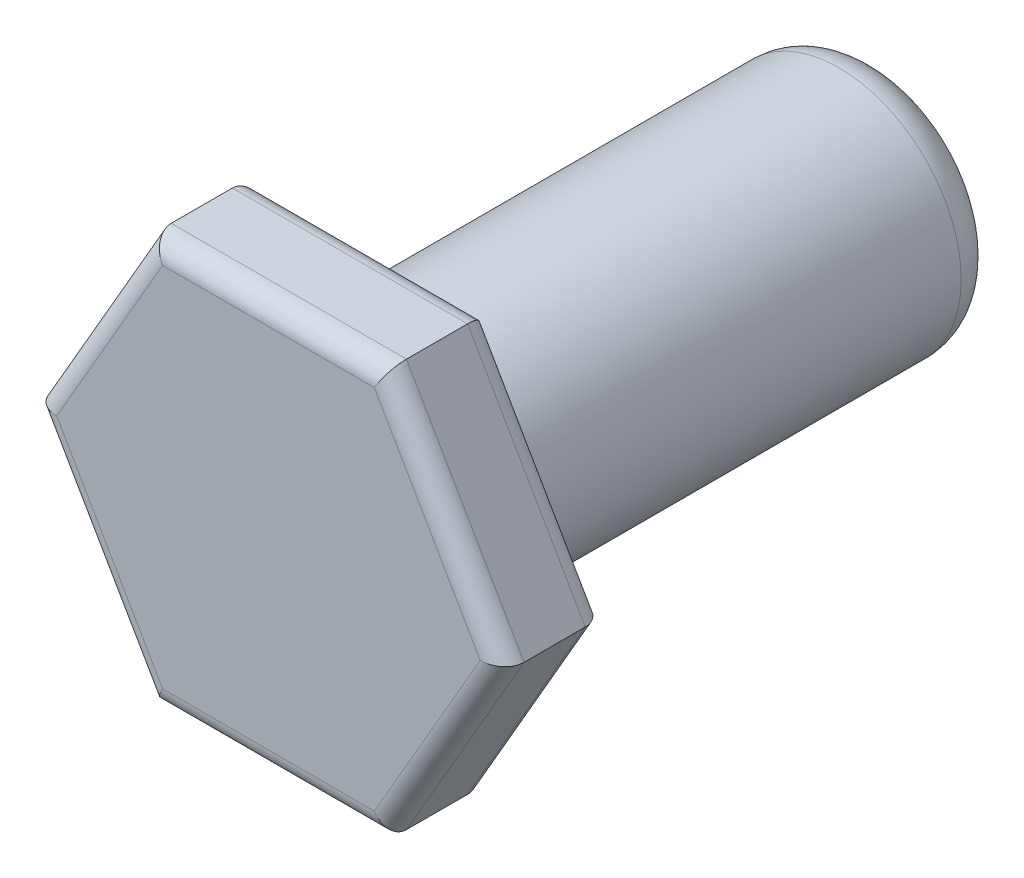
ISO-10303-21;
HEADER;
FILE_DESCRIPTION(('STEP AP214'),'2;1');
FILE_NAME('part.step','',(''),(''),'','','');
FILE_SCHEMA(('AUTOMOTIVE_DESIGN { 1 0 10303 214 1 1 1 1 }'));
ENDSEC;
DATA;
#1=APPLICATION_CONTEXT('core data for automotive mechanical design processes');
#2=APPLICATION_PROTOCOL_DEFINITION('international standard','automotive_design',2000,#1);
#3=PRODUCT_CONTEXT('',#1,'mechanical');
#4=PRODUCT('Part','Part','',(#3));
#5=PRODUCT_RELATED_PRODUCT_CATEGORY('part','',(#4));
#6=PRODUCT_DEFINITION_FORMATION('','',#4);
#7=PRODUCT_DEFINITION_CONTEXT('part definition',#1,'design');
#8=PRODUCT_DEFINITION('design','',#6,#7);
#9=PRODUCT_DEFINITION_SHAPE('','',#8);
#10=(LENGTH_UNIT() NAMED_UNIT(*) SI_UNIT(.MILLI.,.METRE.));
#11=(NAMED_UNIT(*) PLANE_ANGLE_UNIT() SI_UNIT($,.RADIAN.));
#12=(NAMED_UNIT(*) SI_UNIT($,.STERADIAN.) SOLID_ANGLE_UNIT());
#13=UNCERTAINTY_MEASURE_WITH_UNIT(LENGTH_MEASURE(1.E-05),#10,'distance_accuracy_value','');
#14=(GEOMETRIC_REPRESENTATION_CONTEXT(3) GLOBAL_UNCERTAINTY_ASSIGNED_CONTEXT((#13)) GLOBAL_UNIT_ASSIGNED_CONTEXT((#10,
#11,#12)) REPRESENTATION_CONTEXT('',''));
#15=CARTESIAN_POINT('',(0.,0.,0.));
#16=DIRECTION('',(0.,0.,1.));
#17=DIRECTION('',(1.,0.,0.));
#18=AXIS2_PLACEMENT_3D('',#15,#16,#17);
#19=CARTESIAN_POINT('',(0.,0.,25.));
#20=DIRECTION('',(0.,0.,-1.));
#21=DIRECTION('',(-1.,0.,0.));
#22=AXIS2_PLACEMENT_3D('',#19,#20,#21);
#23=CYLINDRICAL_SURFACE('',#22,6.);
#24=CARTESIAN_POINT('',(0.,0.,2.));
#25=DIRECTION('',(0.,0.,1.));
#26=DIRECTION('',(1.,0.,0.));
#27=AXIS2_PLACEMENT_3D('',#24,#25,#26);
#28=CIRCLE('',#27,6.);
#29=CARTESIAN_POINT('',(6.,0.,2.));
#30=VERTEX_POINT('',#29);
#31=EDGE_CURVE('E153',#30,#30,#28,.T.);
#32=ORIENTED_EDGE('',*,*,#31,.T.);
#33=EDGE_LOOP('',(#32));
#34=FACE_BOUND('',#33,.T.);
#35=CARTESIAN_POINT('',(0.,0.,25.));
#36=DIRECTION('',(0.,0.,1.));
#37=DIRECTION('',(1.,0.,0.));
#38=AXIS2_PLACEMENT_3D('',#35,#36,#37);
#39=CIRCLE('',#38,6.);
#40=CARTESIAN_POINT('',(6.,0.,25.));
#41=VERTEX_POINT('',#40);
#42=EDGE_CURVE('E258',#41,#41,#39,.T.);
#43=ORIENTED_EDGE('',*,*,#42,.F.);
#44=EDGE_LOOP('',(#43));
#45=FACE_BOUND('',#44,.T.);
#46=ADVANCED_FACE('F34',(#34,#45),#23,.T.);
#47=CARTESIAN_POINT('',(0.,0.,0.));
#48=DIRECTION('',(0.,0.,1.));
#49=DIRECTION('',(1.,0.,0.));
#50=AXIS2_PLACEMENT_3D('',#47,#48,#49);
#51=PLANE('',#50);
#52=CARTESIAN_POINT('',(0.,0.,0.));
#53=DIRECTION('',(0.,0.,1.));
#54=DIRECTION('',(1.,0.,0.));
#55=AXIS2_PLACEMENT_3D('',#52,#53,#54);
#56=CIRCLE('',#55,4.);
#57=CARTESIAN_POINT('',(4.,0.,0.));
#58=VERTEX_POINT('',#57);
#59=EDGE_CURVE('E150',#58,#58,#56,.F.);
#60=ORIENTED_EDGE('',*,*,#59,.T.);
#61=EDGE_LOOP('',(#60));
#62=FACE_BOUND('',#61,.T.);
#63=ADVANCED_FACE('F285',(#62),#51,.F.);
#64=CARTESIAN_POINT('',(0.,0.,25.));
#65=DIRECTION('',(0.,0.,1.));
#66=DIRECTION('',(1.,0.,0.));
#67=AXIS2_PLACEMENT_3D('',#64,#65,#66);
#68=PLANE('',#67);
#69=DIRECTION('',(-1.,0.,0.));
#70=VECTOR('',#69,1.);
#71=CARTESIAN_POINT('',(0.,9.,25.));
#72=LINE('',#71,#70);
#73=CARTESIAN_POINT('',(-5.19615242270663,9.,25.));
#74=VERTEX_POINT('',#73);
#75=CARTESIAN_POINT('',(5.19615242270663,9.,25.));
#76=VERTEX_POINT('',#75);
#77=EDGE_CURVE('E182',#74,#76,#72,.F.);
#78=ORIENTED_EDGE('',*,*,#77,.T.);
#79=DIRECTION('',(-0.5,0.866025403784438,0.));
#80=VECTOR('',#79,1.);
#81=CARTESIAN_POINT('',(7.79422863405995,4.5,25.));
#82=LINE('',#81,#80);
#83=CARTESIAN_POINT('',(10.3923048454133,0.,25.));
#84=VERTEX_POINT('',#83);
#85=EDGE_CURVE('E188',#76,#84,#82,.F.);
#86=ORIENTED_EDGE('',*,*,#85,.T.);
#87=DIRECTION('',(0.5,0.866025403784439,0.));
#88=VECTOR('',#87,1.);
#89=CARTESIAN_POINT('',(7.79422863405995,-4.5,25.));
#90=LINE('',#89,#88);
#91=CARTESIAN_POINT('',(5.19615242270663,-9.,25.));
#92=VERTEX_POINT('',#91);
#93=EDGE_CURVE('E186',#84,#92,#90,.F.);
#94=ORIENTED_EDGE('',*,*,#93,.T.);
#95=DIRECTION('',(1.,0.,0.));
#96=VECTOR('',#95,1.);
#97=CARTESIAN_POINT('',(0.,-9.,25.));
#98=LINE('',#97,#96);
#99=CARTESIAN_POINT('',(-5.19615242270663,-9.,25.));
#100=VERTEX_POINT('',#99);
#101=EDGE_CURVE('E184',#92,#100,#98,.F.);
#102=ORIENTED_EDGE('',*,*,#101,.T.);
#103=DIRECTION('',(0.5,-0.866025403784439,0.));
#104=VECTOR('',#103,1.);
#105=CARTESIAN_POINT('',(-7.79422863405994,-4.5,25.));
#106=LINE('',#105,#104);
#107=CARTESIAN_POINT('',(-10.3923048454133,0.,25.));
#108=VERTEX_POINT('',#107);
#109=EDGE_CURVE('E178',#100,#108,#106,.F.);
#110=ORIENTED_EDGE('',*,*,#109,.T.);
#111=DIRECTION('',(-0.5,-0.866025403784439,0.));
#112=VECTOR('',#111,1.);
#113=CARTESIAN_POINT('',(-7.79422863405995,4.5,25.));
#114=LINE('',#113,#112);
#115=EDGE_CURVE('E180',#108,#74,#114,.F.);
#116=ORIENTED_EDGE('',*,*,#115,.T.);
#117=EDGE_LOOP('',(#78,#86,#94,#102,#110,#116));
#118=FACE_BOUND('',#117,.T.);
#119=ORIENTED_EDGE('',*,*,#42,.T.);
#120=EDGE_LOOP('',(#119));
#121=FACE_BOUND('',#120,.T.);
#122=ADVANCED_FACE('F232',(#118,#121),#68,.F.);
#123=CARTESIAN_POINT('',(-5.77350269189626,-10.,30.));
#124=DIRECTION('',(0.,1.,0.));
#125=DIRECTION('',(0.,0.,1.));
#126=AXIS2_PLACEMENT_3D('',#123,#124,#125);
#127=PLANE('',#126);
#128=DIRECTION('',(0.,0.,-1.));
#129=VECTOR('',#128,1.);
#130=CARTESIAN_POINT('',(5.77350269189626,-10.,30.));
#131=LINE('',#130,#129);
#132=CARTESIAN_POINT('',(5.77350269189626,-10.,29.));
#133=VERTEX_POINT('',#132);
#134=CARTESIAN_POINT('',(5.77350269189626,-10.,26.));
#135=VERTEX_POINT('',#134);
#136=EDGE_CURVE('E250',#133,#135,#131,.T.);
#137=ORIENTED_EDGE('',*,*,#136,.F.);
#138=DIRECTION('',(1.,0.,0.));
#139=VECTOR('',#138,1.);
#140=CARTESIAN_POINT('',(-5.77350269189626,-10.,29.));
#141=LINE('',#140,#139);
#142=CARTESIAN_POINT('',(-5.77350269189626,-10.,29.));
#143=VERTEX_POINT('',#142);
#144=EDGE_CURVE('E193',#133,#143,#141,.F.);
#145=ORIENTED_EDGE('',*,*,#144,.T.);
#146=DIRECTION('',(0.,0.,-1.));
#147=VECTOR('',#146,1.);
#148=CARTESIAN_POINT('',(-5.77350269189626,-10.,30.));
#149=LINE('',#148,#147);
#150=CARTESIAN_POINT('',(-5.77350269189626,-10.,26.));
#151=VERTEX_POINT('',#150);
#152=EDGE_CURVE('E143',#143,#151,#149,.T.);
#153=ORIENTED_EDGE('',*,*,#152,.T.);
#154=DIRECTION('',(1.,0.,0.));
#155=VECTOR('',#154,1.);
#156=CARTESIAN_POINT('',(-5.77350269189626,-10.,26.));
#157=LINE('',#156,#155);
#158=EDGE_CURVE('E191',#151,#135,#157,.T.);
#159=ORIENTED_EDGE('',*,*,#158,.T.);
#160=EDGE_LOOP('',(#137,#145,#153,#159));
#161=FACE_BOUND('',#160,.T.);
#162=ADVANCED_FACE('F292',(#161),#127,.F.);
#163=CARTESIAN_POINT('',(5.77350269189626,-10.,30.));
#164=DIRECTION('',(-0.866025403784439,0.5,0.));
#165=DIRECTION('',(-0.5,-0.866025403784439,0.));
#166=AXIS2_PLACEMENT_3D('',#163,#164,#165);
#167=PLANE('',#166);
#168=DIRECTION('',(0.,0.,-1.));
#169=VECTOR('',#168,1.);
#170=CARTESIAN_POINT('',(11.5470053837925,0.,30.));
#171=LINE('',#170,#169);
#172=CARTESIAN_POINT('',(11.5470053837925,0.,29.));
#173=VERTEX_POINT('',#172);
#174=CARTESIAN_POINT('',(11.5470053837925,0.,26.));
#175=VERTEX_POINT('',#174);
#176=EDGE_CURVE('E247',#173,#175,#171,.T.);
#177=ORIENTED_EDGE('',*,*,#176,.F.);
#178=DIRECTION('',(0.5,0.866025403784439,0.));
#179=VECTOR('',#178,1.);
#180=CARTESIAN_POINT('',(5.77350269189626,-10.,29.));
#181=LINE('',#180,#179);
#182=EDGE_CURVE('E166',#173,#133,#181,.F.);
#183=ORIENTED_EDGE('',*,*,#182,.T.);
#184=ORIENTED_EDGE('',*,*,#136,.T.);
#185=DIRECTION('',(0.5,0.866025403784439,0.));
#186=VECTOR('',#185,1.);
#187=CARTESIAN_POINT('',(5.77350269189626,-10.,26.));
#188=LINE('',#187,#186);
#189=EDGE_CURVE('E164',#135,#175,#188,.T.);
#190=ORIENTED_EDGE('',*,*,#189,.T.);
#191=EDGE_LOOP('',(#177,#183,#184,#190));
#192=FACE_BOUND('',#191,.T.);
#193=ADVANCED_FACE('F246',(#192),#167,.F.);
#194=CARTESIAN_POINT('',(11.5470053837925,0.,30.));
#195=DIRECTION('',(-0.866025403784438,-0.5,0.));
#196=DIRECTION('',(0.5,-0.866025403784438,0.));
#197=AXIS2_PLACEMENT_3D('',#194,#195,#196);
#198=PLANE('',#197);
#199=DIRECTION('',(0.,0.,-1.));
#200=VECTOR('',#199,1.);
#201=CARTESIAN_POINT('',(5.77350269189625,10.,30.));
#202=LINE('',#201,#200);
#203=CARTESIAN_POINT('',(5.77350269189625,10.,29.));
#204=VERTEX_POINT('',#203);
#205=CARTESIAN_POINT('',(5.77350269189625,10.,26.));
#206=VERTEX_POINT('',#205);
#207=EDGE_CURVE('E256',#204,#206,#202,.T.);
#208=ORIENTED_EDGE('',*,*,#207,.F.);
#209=DIRECTION('',(-0.5,0.866025403784438,0.));
#210=VECTOR('',#209,1.);
#211=CARTESIAN_POINT('',(11.5470053837925,0.,29.));
#212=LINE('',#211,#210);
#213=EDGE_CURVE('E172',#204,#173,#212,.F.);
#214=ORIENTED_EDGE('',*,*,#213,.T.);
#215=ORIENTED_EDGE('',*,*,#176,.T.);
#216=DIRECTION('',(-0.5,0.866025403784438,0.));
#217=VECTOR('',#216,1.);
#218=CARTESIAN_POINT('',(11.5470053837925,0.,26.));
#219=LINE('',#218,#217);
#220=EDGE_CURVE('E169',#175,#206,#219,.T.);
#221=ORIENTED_EDGE('',*,*,#220,.T.);
#222=EDGE_LOOP('',(#208,#214,#215,#221));
#223=FACE_BOUND('',#222,.T.);
#224=ADVANCED_FACE('F253',(#223),#198,.F.);
#225=CARTESIAN_POINT('',(5.77350269189625,10.,30.));
#226=DIRECTION('',(0.,-1.,0.));
#227=DIRECTION('',(1.,0.,0.));
#228=AXIS2_PLACEMENT_3D('',#225,#226,#227);
#229=PLANE('',#228);
#230=DIRECTION('',(0.,0.,-1.));
#231=VECTOR('',#230,1.);
#232=CARTESIAN_POINT('',(-5.77350269189626,10.,30.));
#233=LINE('',#232,#231);
#234=CARTESIAN_POINT('',(-5.77350269189626,10.,29.));
#235=VERTEX_POINT('',#234);
#236=CARTESIAN_POINT('',(-5.77350269189626,10.,26.));
#237=VERTEX_POINT('',#236);
#238=EDGE_CURVE('E260',#235,#237,#233,.T.);
#239=ORIENTED_EDGE('',*,*,#238,.F.);
#240=DIRECTION('',(-1.,0.,0.));
#241=VECTOR('',#240,1.);
#242=CARTESIAN_POINT('',(5.77350269189625,10.,29.));
#243=LINE('',#242,#241);
#244=EDGE_CURVE('E176',#235,#204,#243,.F.);
#245=ORIENTED_EDGE('',*,*,#244,.T.);
#246=ORIENTED_EDGE('',*,*,#207,.T.);
#247=DIRECTION('',(-1.,0.,0.));
#248=VECTOR('',#247,1.);
#249=CARTESIAN_POINT('',(5.77350269189625,10.,26.));
#250=LINE('',#249,#248);
#251=EDGE_CURVE('E174',#206,#237,#250,.T.);
#252=ORIENTED_EDGE('',*,*,#251,.T.);
#253=EDGE_LOOP('',(#239,#245,#246,#252));
#254=FACE_BOUND('',#253,.T.);
#255=ADVANCED_FACE('F300',(#254),#229,.F.);
#256=CARTESIAN_POINT('',(-5.77350269189626,10.,30.));
#257=DIRECTION('',(0.866025403784439,-0.5,0.));
#258=DIRECTION('',(0.5,0.866025403784439,0.));
#259=AXIS2_PLACEMENT_3D('',#256,#257,#258);
#260=PLANE('',#259);
#261=ORIENTED_EDGE('',*,*,#238,.T.);
#262=DIRECTION('',(-0.5,-0.866025403784439,0.));
#263=VECTOR('',#262,1.);
#264=CARTESIAN_POINT('',(-5.77350269189626,10.,26.));
#265=LINE('',#264,#263);
#266=CARTESIAN_POINT('',(-11.5470053837925,0.,26.));
#267=VERTEX_POINT('',#266);
#268=EDGE_CURVE('E51',#237,#267,#265,.T.);
#269=ORIENTED_EDGE('',*,*,#268,.T.);
#270=DIRECTION('',(0.,0.,-1.));
#271=VECTOR('',#270,1.);
#272=CARTESIAN_POINT('',(-11.5470053837925,0.,30.));
#273=LINE('',#272,#271);
#274=CARTESIAN_POINT('',(-11.5470053837925,0.,29.));
#275=VERTEX_POINT('',#274);
#276=EDGE_CURVE('E455',#275,#267,#273,.T.);
#277=ORIENTED_EDGE('',*,*,#276,.F.);
#278=DIRECTION('',(-0.5,-0.866025403784439,0.));
#279=VECTOR('',#278,1.);
#280=CARTESIAN_POINT('',(-5.77350269189626,10.,29.));
#281=LINE('',#280,#279);
#282=EDGE_CURVE('E141',#275,#235,#281,.F.);
#283=ORIENTED_EDGE('',*,*,#282,.T.);
#284=EDGE_LOOP('',(#261,#269,#277,#283));
#285=FACE_BOUND('',#284,.T.);
#286=ADVANCED_FACE('F303',(#285),#260,.F.);
#287=CARTESIAN_POINT('',(-11.5470053837925,0.,30.));
#288=DIRECTION('',(0.866025403784438,0.5,0.));
#289=DIRECTION('',(-0.5,0.866025403784439,0.));
#290=AXIS2_PLACEMENT_3D('',#287,#288,#289);
#291=PLANE('',#290);
#292=ORIENTED_EDGE('',*,*,#152,.F.);
#293=DIRECTION('',(0.5,-0.866025403784439,0.));
#294=VECTOR('',#293,1.);
#295=CARTESIAN_POINT('',(-11.5470053837925,0.,29.));
#296=LINE('',#295,#294);
#297=EDGE_CURVE('E11',#143,#275,#296,.F.);
#298=ORIENTED_EDGE('',*,*,#297,.T.);
#299=ORIENTED_EDGE('',*,*,#276,.T.);
#300=DIRECTION('',(0.5,-0.866025403784439,0.));
#301=VECTOR('',#300,1.);
#302=CARTESIAN_POINT('',(-11.5470053837925,0.,26.));
#303=LINE('',#302,#301);
#304=EDGE_CURVE('E43',#267,#151,#303,.T.);
#305=ORIENTED_EDGE('',*,*,#304,.T.);
#306=EDGE_LOOP('',(#292,#298,#299,#305));
#307=FACE_BOUND('',#306,.T.);
#308=ADVANCED_FACE('F279',(#307),#291,.F.);
#309=CARTESIAN_POINT('',(0.,0.,30.));
#310=DIRECTION('',(0.,0.,1.));
#311=DIRECTION('',(1.,0.,0.));
#312=AXIS2_PLACEMENT_3D('',#309,#310,#311);
#313=PLANE('',#312);
#314=DIRECTION('',(1.,0.,0.));
#315=VECTOR('',#314,1.);
#316=CARTESIAN_POINT('',(5.77350269189626,-9.,30.));
#317=LINE('',#316,#315);
#318=CARTESIAN_POINT('',(-5.19615242270663,-9.,30.));
#319=VERTEX_POINT('',#318);
#320=CARTESIAN_POINT('',(5.19615242270663,-9.,30.));
#321=VERTEX_POINT('',#320);
#322=EDGE_CURVE('E135',#319,#321,#317,.T.);
#323=ORIENTED_EDGE('',*,*,#322,.T.);
#324=DIRECTION('',(0.5,0.866025403784439,0.));
#325=VECTOR('',#324,1.);
#326=CARTESIAN_POINT('',(10.6809799800081,0.500000000000005,30.));
#327=LINE('',#326,#325);
#328=CARTESIAN_POINT('',(10.3923048454133,0.,30.));
#329=VERTEX_POINT('',#328);
#330=EDGE_CURVE('E161',#321,#329,#327,.T.);
#331=ORIENTED_EDGE('',*,*,#330,.T.);
#332=DIRECTION('',(-0.5,0.866025403784438,0.));
#333=VECTOR('',#332,1.);
#334=CARTESIAN_POINT('',(4.90747728811182,9.5,30.));
#335=LINE('',#334,#333);
#336=CARTESIAN_POINT('',(5.19615242270663,9.,30.));
#337=VERTEX_POINT('',#336);
#338=EDGE_CURVE('E159',#329,#337,#335,.T.);
#339=ORIENTED_EDGE('',*,*,#338,.T.);
#340=DIRECTION('',(-1.,0.,0.));
#341=VECTOR('',#340,1.);
#342=CARTESIAN_POINT('',(-5.77350269189626,9.,30.));
#343=LINE('',#342,#341);
#344=CARTESIAN_POINT('',(-5.19615242270663,9.,30.));
#345=VERTEX_POINT('',#344);
#346=EDGE_CURVE('E131',#337,#345,#343,.T.);
#347=ORIENTED_EDGE('',*,*,#346,.T.);
#348=DIRECTION('',(-0.5,-0.866025403784439,0.));
#349=VECTOR('',#348,1.);
#350=CARTESIAN_POINT('',(-10.6809799800081,-0.499999999999999,30.));
#351=LINE('',#350,#349);
#352=CARTESIAN_POINT('',(-10.3923048454133,0.,30.));
#353=VERTEX_POINT('',#352);
#354=EDGE_CURVE('E124',#345,#353,#351,.T.);
#355=ORIENTED_EDGE('',*,*,#354,.T.);
#356=DIRECTION('',(0.5,-0.866025403784439,0.));
#357=VECTOR('',#356,1.);
#358=CARTESIAN_POINT('',(-4.90747728811181,-9.5,30.));
#359=LINE('',#358,#357);
#360=EDGE_CURVE('E128',#353,#319,#359,.T.);
#361=ORIENTED_EDGE('',*,*,#360,.T.);
#362=EDGE_LOOP('',(#323,#331,#339,#347,#355,#361));
#363=FACE_BOUND('',#362,.T.);
#364=ADVANCED_FACE('F126',(#363),#313,.T.);
#365=CARTESIAN_POINT('',(0.,0.,2.));
#366=DIRECTION('',(0.,0.,1.));
#367=DIRECTION('',(1.,0.,0.));
#368=AXIS2_PLACEMENT_3D('',#365,#366,#367);
#369=TOROIDAL_SURFACE('',#368,4.,2.);
#370=ORIENTED_EDGE('',*,*,#59,.F.);
#371=EDGE_LOOP('',(#370));
#372=FACE_BOUND('',#371,.T.);
#373=ORIENTED_EDGE('',*,*,#31,.F.);
#374=EDGE_LOOP('',(#373));
#375=FACE_BOUND('',#374,.T.);
#376=ADVANCED_FACE('F270',(#372,#375),#369,.T.);
#377=CARTESIAN_POINT('',(-7.79422863405995,4.5,29.));
#378=DIRECTION('',(0.5,0.866025403784439,0.));
#379=DIRECTION('',(-0.866025403784439,0.5,0.));
#380=AXIS2_PLACEMENT_3D('',#377,#378,#379);
#381=CYLINDRICAL_SURFACE('',#380,1.);
#382=CARTESIAN_POINT('',(-5.19615242270663,9.,29.));
#383=DIRECTION('',(0.866025403784439,0.5,0.));
#384=DIRECTION('',(-0.5,0.866025403784439,0.));
#385=AXIS2_PLACEMENT_3D('',#382,#383,#384);
#386=ELLIPSE('',#385,1.15470053837925,1.);
#387=EDGE_CURVE('E144',#235,#345,#386,.T.);
#388=ORIENTED_EDGE('',*,*,#387,.F.);
#389=ORIENTED_EDGE('',*,*,#282,.F.);
#390=CARTESIAN_POINT('',(-10.3923048454133,0.,29.));
#391=DIRECTION('',(0.,1.,0.));
#392=DIRECTION('',(-1.,0.,0.));
#393=AXIS2_PLACEMENT_3D('',#390,#391,#392);
#394=ELLIPSE('',#393,1.15470053837925,1.);
#395=EDGE_CURVE('E139',#353,#275,#394,.F.);
#396=ORIENTED_EDGE('',*,*,#395,.F.);
#397=ORIENTED_EDGE('',*,*,#354,.F.);
#398=EDGE_LOOP('',(#388,#389,#396,#397));
#399=FACE_BOUND('',#398,.T.);
#400=ADVANCED_FACE('F140',(#399),#381,.T.);
#401=CARTESIAN_POINT('',(-7.79422863405994,-4.5,29.));
#402=DIRECTION('',(-0.5,0.866025403784439,0.));
#403=DIRECTION('',(-0.866025403784438,-0.5,0.));
#404=AXIS2_PLACEMENT_3D('',#401,#402,#403);
#405=CYLINDRICAL_SURFACE('',#404,1.);
#406=ORIENTED_EDGE('',*,*,#395,.T.);
#407=ORIENTED_EDGE('',*,*,#297,.F.);
#408=CARTESIAN_POINT('',(-5.19615242270663,-9.,29.));
#409=DIRECTION('',(-0.866025403784439,0.5,0.));
#410=DIRECTION('',(0.5,0.866025403784439,0.));
#411=AXIS2_PLACEMENT_3D('',#408,#409,#410);
#412=ELLIPSE('',#411,1.15470053837925,1.);
#413=EDGE_CURVE('E148',#319,#143,#412,.F.);
#414=ORIENTED_EDGE('',*,*,#413,.F.);
#415=ORIENTED_EDGE('',*,*,#360,.F.);
#416=EDGE_LOOP('',(#406,#407,#414,#415));
#417=FACE_BOUND('',#416,.T.);
#418=ADVANCED_FACE('F146',(#417),#405,.T.);
#419=CARTESIAN_POINT('',(0.,9.,29.));
#420=DIRECTION('',(1.,0.,0.));
#421=DIRECTION('',(0.,1.,0.));
#422=AXIS2_PLACEMENT_3D('',#419,#420,#421);
#423=CYLINDRICAL_SURFACE('',#422,1.);
#424=ORIENTED_EDGE('',*,*,#387,.T.);
#425=ORIENTED_EDGE('',*,*,#346,.F.);
#426=CARTESIAN_POINT('',(5.19615242270663,9.,29.));
#427=DIRECTION('',(0.866025403784439,-0.5,0.));
#428=DIRECTION('',(0.5,0.866025403784439,0.));
#429=AXIS2_PLACEMENT_3D('',#426,#427,#428);
#430=ELLIPSE('',#429,1.15470053837925,1.);
#431=EDGE_CURVE('E202',#204,#337,#430,.T.);
#432=ORIENTED_EDGE('',*,*,#431,.F.);
#433=ORIENTED_EDGE('',*,*,#244,.F.);
#434=EDGE_LOOP('',(#424,#425,#432,#433));
#435=FACE_BOUND('',#434,.T.);
#436=ADVANCED_FACE('F358',(#435),#423,.T.);
#437=CARTESIAN_POINT('',(0.,-9.,29.));
#438=DIRECTION('',(-1.,0.,0.));
#439=DIRECTION('',(0.,0.,1.));
#440=AXIS2_PLACEMENT_3D('',#437,#438,#439);
#441=CYLINDRICAL_SURFACE('',#440,1.);
#442=ORIENTED_EDGE('',*,*,#413,.T.);
#443=ORIENTED_EDGE('',*,*,#144,.F.);
#444=CARTESIAN_POINT('',(5.19615242270663,-9.,29.));
#445=DIRECTION('',(-0.866025403784439,-0.5,0.));
#446=DIRECTION('',(-0.5,0.866025403784439,0.));
#447=AXIS2_PLACEMENT_3D('',#444,#445,#446);
#448=ELLIPSE('',#447,1.15470053837925,1.);
#449=EDGE_CURVE('E200',#321,#133,#448,.F.);
#450=ORIENTED_EDGE('',*,*,#449,.F.);
#451=ORIENTED_EDGE('',*,*,#322,.F.);
#452=EDGE_LOOP('',(#442,#443,#450,#451));
#453=FACE_BOUND('',#452,.T.);
#454=ADVANCED_FACE('F367',(#453),#441,.T.);
#455=CARTESIAN_POINT('',(7.79422863405995,4.5,29.));
#456=DIRECTION('',(0.5,-0.866025403784438,0.));
#457=DIRECTION('',(0.866025403784438,0.5,0.));
#458=AXIS2_PLACEMENT_3D('',#455,#456,#457);
#459=CYLINDRICAL_SURFACE('',#458,1.);
#460=ORIENTED_EDGE('',*,*,#431,.T.);
#461=ORIENTED_EDGE('',*,*,#338,.F.);
#462=CARTESIAN_POINT('',(10.3923048454133,0.,29.));
#463=DIRECTION('',(0.,-1.,0.));
#464=DIRECTION('',(1.,0.,0.));
#465=AXIS2_PLACEMENT_3D('',#462,#463,#464);
#466=ELLIPSE('',#465,1.15470053837925,1.);
#467=EDGE_CURVE('E198',#173,#329,#466,.T.);
#468=ORIENTED_EDGE('',*,*,#467,.F.);
#469=ORIENTED_EDGE('',*,*,#213,.F.);
#470=EDGE_LOOP('',(#460,#461,#468,#469));
#471=FACE_BOUND('',#470,.T.);
#472=ADVANCED_FACE('F377',(#471),#459,.T.);
#473=CARTESIAN_POINT('',(7.79422863405995,-4.5,29.));
#474=DIRECTION('',(-0.5,-0.866025403784439,0.));
#475=DIRECTION('',(0.866025403784439,-0.5,0.));
#476=AXIS2_PLACEMENT_3D('',#473,#474,#475);
#477=CYLINDRICAL_SURFACE('',#476,1.);
#478=ORIENTED_EDGE('',*,*,#449,.T.);
#479=ORIENTED_EDGE('',*,*,#182,.F.);
#480=ORIENTED_EDGE('',*,*,#467,.T.);
#481=ORIENTED_EDGE('',*,*,#330,.F.);
#482=EDGE_LOOP('',(#478,#479,#480,#481));
#483=FACE_BOUND('',#482,.T.);
#484=ADVANCED_FACE('F387',(#483),#477,.T.);
#485=CARTESIAN_POINT('',(-10.6809799800081,0.500000000000002,26.));
#486=DIRECTION('',(0.5,-0.866025403784439,0.));
#487=DIRECTION('',(0.866025403784438,0.5,0.));
#488=AXIS2_PLACEMENT_3D('',#485,#486,#487);
#489=CYLINDRICAL_SURFACE('',#488,1.);
#490=CARTESIAN_POINT('',(-10.3923048454133,0.,26.));
#491=DIRECTION('',(0.,-1.,0.));
#492=DIRECTION('',(1.,0.,0.));
#493=AXIS2_PLACEMENT_3D('',#490,#491,#492);
#494=ELLIPSE('',#493,1.15470053837925,1.);
#495=EDGE_CURVE('E216',#108,#267,#494,.F.);
#496=ORIENTED_EDGE('',*,*,#495,.F.);
#497=ORIENTED_EDGE('',*,*,#109,.F.);
#498=CARTESIAN_POINT('',(-5.19615242270663,-9.,26.));
#499=DIRECTION('',(0.866025403784439,-0.5,0.));
#500=DIRECTION('',(-0.5,-0.866025403784439,0.));
#501=AXIS2_PLACEMENT_3D('',#498,#499,#500);
#502=ELLIPSE('',#501,1.15470053837925,1.);
#503=EDGE_CURVE('E38',#151,#100,#502,.T.);
#504=ORIENTED_EDGE('',*,*,#503,.F.);
#505=ORIENTED_EDGE('',*,*,#304,.F.);
#506=EDGE_LOOP('',(#496,#497,#504,#505));
#507=FACE_BOUND('',#506,.T.);
#508=ADVANCED_FACE('F36',(#507),#489,.T.);
#509=CARTESIAN_POINT('',(-5.77350269189626,-9.,26.));
#510=DIRECTION('',(1.,0.,0.));
#511=DIRECTION('',(0.,0.,-1.));
#512=AXIS2_PLACEMENT_3D('',#509,#510,#511);
#513=CYLINDRICAL_SURFACE('',#512,1.);
#514=ORIENTED_EDGE('',*,*,#503,.T.);
#515=ORIENTED_EDGE('',*,*,#101,.F.);
#516=CARTESIAN_POINT('',(5.19615242270663,-9.,26.));
#517=DIRECTION('',(0.866025403784439,0.5,0.));
#518=DIRECTION('',(0.5,-0.866025403784439,0.));
#519=AXIS2_PLACEMENT_3D('',#516,#517,#518);
#520=ELLIPSE('',#519,1.15470053837925,1.);
#521=EDGE_CURVE('E214',#135,#92,#520,.T.);
#522=ORIENTED_EDGE('',*,*,#521,.F.);
#523=ORIENTED_EDGE('',*,*,#158,.F.);
#524=EDGE_LOOP('',(#514,#515,#522,#523));
#525=FACE_BOUND('',#524,.T.);
#526=ADVANCED_FACE('F226',(#525),#513,.T.);
#527=CARTESIAN_POINT('',(-4.90747728811182,9.5,26.));
#528=DIRECTION('',(-0.5,-0.866025403784439,0.));
#529=DIRECTION('',(0.866025403784439,-0.5,0.));
#530=AXIS2_PLACEMENT_3D('',#527,#528,#529);
#531=CYLINDRICAL_SURFACE('',#530,1.);
#532=ORIENTED_EDGE('',*,*,#495,.T.);
#533=ORIENTED_EDGE('',*,*,#268,.F.);
#534=CARTESIAN_POINT('',(-5.19615242270663,9.,26.));
#535=DIRECTION('',(-0.866025403784439,-0.5,0.));
#536=DIRECTION('',(0.5,-0.866025403784439,0.));
#537=AXIS2_PLACEMENT_3D('',#534,#535,#536);
#538=ELLIPSE('',#537,1.15470053837925,1.);
#539=EDGE_CURVE('E211',#74,#237,#538,.F.);
#540=ORIENTED_EDGE('',*,*,#539,.F.);
#541=ORIENTED_EDGE('',*,*,#115,.F.);
#542=EDGE_LOOP('',(#532,#533,#540,#541));
#543=FACE_BOUND('',#542,.T.);
#544=ADVANCED_FACE('F412',(#543),#531,.T.);
#545=CARTESIAN_POINT('',(4.90747728811182,-9.5,26.));
#546=DIRECTION('',(0.5,0.866025403784439,0.));
#547=DIRECTION('',(-0.866025403784439,0.5,0.));
#548=AXIS2_PLACEMENT_3D('',#545,#546,#547);
#549=CYLINDRICAL_SURFACE('',#548,1.);
#550=ORIENTED_EDGE('',*,*,#521,.T.);
#551=ORIENTED_EDGE('',*,*,#93,.F.);
#552=CARTESIAN_POINT('',(10.3923048454133,0.,26.));
#553=DIRECTION('',(0.,1.,0.));
#554=DIRECTION('',(1.,0.,0.));
#555=AXIS2_PLACEMENT_3D('',#552,#553,#554);
#556=ELLIPSE('',#555,1.15470053837925,1.);
#557=EDGE_CURVE('E209',#175,#84,#556,.T.);
#558=ORIENTED_EDGE('',*,*,#557,.F.);
#559=ORIENTED_EDGE('',*,*,#189,.F.);
#560=EDGE_LOOP('',(#550,#551,#558,#559));
#561=FACE_BOUND('',#560,.T.);
#562=ADVANCED_FACE('F239',(#561),#549,.T.);
#563=CARTESIAN_POINT('',(5.77350269189625,9.,26.));
#564=DIRECTION('',(-1.,0.,0.));
#565=DIRECTION('',(0.,-1.,0.));
#566=AXIS2_PLACEMENT_3D('',#563,#564,#565);
#567=CYLINDRICAL_SURFACE('',#566,1.);
#568=ORIENTED_EDGE('',*,*,#539,.T.);
#569=ORIENTED_EDGE('',*,*,#251,.F.);
#570=CARTESIAN_POINT('',(5.19615242270663,9.,26.));
#571=DIRECTION('',(-0.866025403784439,0.5,0.));
#572=DIRECTION('',(-0.5,-0.866025403784439,0.));
#573=AXIS2_PLACEMENT_3D('',#570,#571,#572);
#574=ELLIPSE('',#573,1.15470053837925,1.);
#575=EDGE_CURVE('E207',#76,#206,#574,.F.);
#576=ORIENTED_EDGE('',*,*,#575,.F.);
#577=ORIENTED_EDGE('',*,*,#77,.F.);
#578=EDGE_LOOP('',(#568,#569,#576,#577));
#579=FACE_BOUND('',#578,.T.);
#580=ADVANCED_FACE('F428',(#579),#567,.T.);
#581=CARTESIAN_POINT('',(10.6809799800081,-0.499999999999998,26.));
#582=DIRECTION('',(-0.5,0.866025403784438,0.));
#583=DIRECTION('',(-0.866025403784438,-0.5,0.));
#584=AXIS2_PLACEMENT_3D('',#581,#582,#583);
#585=CYLINDRICAL_SURFACE('',#584,1.);
#586=ORIENTED_EDGE('',*,*,#557,.T.);
#587=ORIENTED_EDGE('',*,*,#85,.F.);
#588=ORIENTED_EDGE('',*,*,#575,.T.);
#589=ORIENTED_EDGE('',*,*,#220,.F.);
#590=EDGE_LOOP('',(#586,#587,#588,#589));
#591=FACE_BOUND('',#590,.T.);
#592=ADVANCED_FACE('F437',(#591),#585,.T.);
#593=CLOSED_SHELL('',(#46,#63,#122,#162,#193,#224,#255,#286,#308,#364,#376,#400,#418,#436,#454,
#472,#484,#508,#526,#544,#562,#580,#592));
#594=MANIFOLD_SOLID_BREP('B2',#593);
#595=ADVANCED_BREP_SHAPE_REPRESENTATION('',(#18,#594),#14);
#596=SHAPE_DEFINITION_REPRESENTATION(#9,#595);
ENDSEC;
END-ISO-10303-21;
